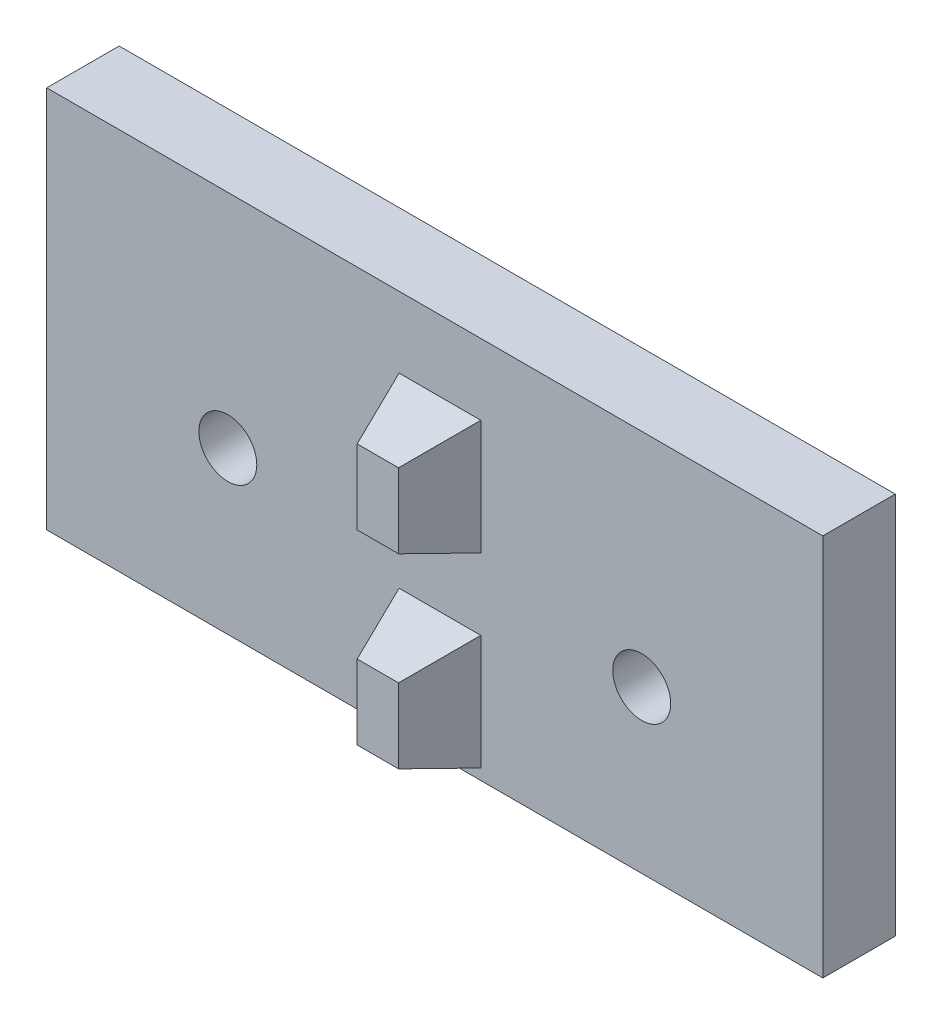
ISO-10303-21;
HEADER;
FILE_DESCRIPTION(('STEP AP214'),'2;1');
FILE_NAME('part.step','',(''),(''),'','','');
FILE_SCHEMA(('AUTOMOTIVE_DESIGN { 1 0 10303 214 1 1 1 1 }'));
ENDSEC;
DATA;
#1=APPLICATION_CONTEXT('core data for automotive mechanical design processes');
#2=APPLICATION_PROTOCOL_DEFINITION('international standard','automotive_design',2000,#1);
#3=PRODUCT_CONTEXT('',#1,'mechanical');
#4=PRODUCT('Part','Part','',(#3));
#5=PRODUCT_RELATED_PRODUCT_CATEGORY('part','',(#4));
#6=PRODUCT_DEFINITION_FORMATION('','',#4);
#7=PRODUCT_DEFINITION_CONTEXT('part definition',#1,'design');
#8=PRODUCT_DEFINITION('design','',#6,#7);
#9=PRODUCT_DEFINITION_SHAPE('','',#8);
#10=(LENGTH_UNIT() NAMED_UNIT(*) SI_UNIT(.MILLI.,.METRE.));
#11=(NAMED_UNIT(*) PLANE_ANGLE_UNIT() SI_UNIT($,.RADIAN.));
#12=(NAMED_UNIT(*) SI_UNIT($,.STERADIAN.) SOLID_ANGLE_UNIT());
#13=UNCERTAINTY_MEASURE_WITH_UNIT(LENGTH_MEASURE(1.E-05),#10,'distance_accuracy_value','');
#14=(GEOMETRIC_REPRESENTATION_CONTEXT(3) GLOBAL_UNCERTAINTY_ASSIGNED_CONTEXT((#13)) GLOBAL_UNIT_ASSIGNED_CONTEXT((#10,
#11,#12)) REPRESENTATION_CONTEXT('',''));
#15=CARTESIAN_POINT('',(0.,0.,0.));
#16=DIRECTION('',(0.,0.,1.));
#17=DIRECTION('',(1.,0.,0.));
#18=AXIS2_PLACEMENT_3D('',#15,#16,#17);
#19=CARTESIAN_POINT('',(0.,0.,3.5));
#20=DIRECTION('',(0.,0.,1.));
#21=DIRECTION('',(1.,0.,0.));
#22=AXIS2_PLACEMENT_3D('',#19,#20,#21);
#23=PLANE('',#22);
#24=DIRECTION('',(-1.,0.,0.));
#25=VECTOR('',#24,1.);
#26=CARTESIAN_POINT('',(0.,-17.9747590886987,3.5));
#27=LINE('',#26,#25);
#28=CARTESIAN_POINT('',(20.9747590886987,-17.9747590886987,3.5));
#29=VERTEX_POINT('',#28);
#30=CARTESIAN_POINT('',(17.0252409113013,-17.9747590886987,3.5));
#31=VERTEX_POINT('',#30);
#32=EDGE_CURVE('E42',#29,#31,#27,.T.);
#33=ORIENTED_EDGE('',*,*,#32,.T.);
#34=DIRECTION('',(0.,1.,0.));
#35=VECTOR('',#34,1.);
#36=CARTESIAN_POINT('',(17.0252409113013,0.,3.5));
#37=LINE('',#36,#35);
#38=CARTESIAN_POINT('',(17.0252409113013,-12.4252409113013,3.5));
#39=VERTEX_POINT('',#38);
#40=EDGE_CURVE('E11',#31,#39,#37,.T.);
#41=ORIENTED_EDGE('',*,*,#40,.T.);
#42=DIRECTION('',(1.,0.,0.));
#43=VECTOR('',#42,1.);
#44=CARTESIAN_POINT('',(0.,-12.4252409113013,3.5));
#45=LINE('',#44,#43);
#46=CARTESIAN_POINT('',(20.9747590886987,-12.4252409113013,3.5));
#47=VERTEX_POINT('',#46);
#48=EDGE_CURVE('E178',#39,#47,#45,.T.);
#49=ORIENTED_EDGE('',*,*,#48,.T.);
#50=DIRECTION('',(0.,-1.,0.));
#51=VECTOR('',#50,1.);
#52=CARTESIAN_POINT('',(20.9747590886987,0.,3.5));
#53=LINE('',#52,#51);
#54=EDGE_CURVE('E53',#47,#29,#53,.T.);
#55=ORIENTED_EDGE('',*,*,#54,.T.);
#56=EDGE_LOOP('',(#33,#41,#49,#55));
#57=FACE_BOUND('',#56,.T.);
#58=DIRECTION('',(-1.,0.,0.));
#59=VECTOR('',#58,1.);
#60=CARTESIAN_POINT('',(0.,-8.97475908869868,3.5));
#61=LINE('',#60,#59);
#62=CARTESIAN_POINT('',(20.9747590886987,-8.97475908869868,3.5));
#63=VERTEX_POINT('',#62);
#64=CARTESIAN_POINT('',(17.0252409113013,-8.97475908869868,3.5));
#65=VERTEX_POINT('',#64);
#66=EDGE_CURVE('E174',#63,#65,#61,.T.);
#67=ORIENTED_EDGE('',*,*,#66,.T.);
#68=DIRECTION('',(0.,1.,0.));
#69=VECTOR('',#68,1.);
#70=CARTESIAN_POINT('',(17.0252409113013,0.,3.5));
#71=LINE('',#70,#69);
#72=CARTESIAN_POINT('',(17.0252409113013,-3.42524091130131,3.5));
#73=VERTEX_POINT('',#72);
#74=EDGE_CURVE('E176',#65,#73,#71,.T.);
#75=ORIENTED_EDGE('',*,*,#74,.T.);
#76=DIRECTION('',(1.,0.,0.));
#77=VECTOR('',#76,1.);
#78=CARTESIAN_POINT('',(0.,-3.42524091130131,3.5));
#79=LINE('',#78,#77);
#80=CARTESIAN_POINT('',(20.9747590886987,-3.42524091130131,3.5));
#81=VERTEX_POINT('',#80);
#82=EDGE_CURVE('E169',#73,#81,#79,.T.);
#83=ORIENTED_EDGE('',*,*,#82,.T.);
#84=DIRECTION('',(0.,-1.,0.));
#85=VECTOR('',#84,1.);
#86=CARTESIAN_POINT('',(20.9747590886987,0.,3.5));
#87=LINE('',#86,#85);
#88=EDGE_CURVE('E172',#81,#63,#87,.T.);
#89=ORIENTED_EDGE('',*,*,#88,.T.);
#90=EDGE_LOOP('',(#67,#75,#83,#89));
#91=FACE_BOUND('',#90,.T.);
#92=CARTESIAN_POINT('',(8.75,-10.7,3.5));
#93=DIRECTION('',(0.,0.,1.));
#94=DIRECTION('',(1.,0.,0.));
#95=AXIS2_PLACEMENT_3D('',#92,#93,#94);
#96=CIRCLE('',#95,1.4);
#97=CARTESIAN_POINT('',(10.15,-10.7,3.5));
#98=VERTEX_POINT('',#97);
#99=EDGE_CURVE('E357',#98,#98,#96,.T.);
#100=ORIENTED_EDGE('',*,*,#99,.F.);
#101=EDGE_LOOP('',(#100));
#102=FACE_BOUND('',#101,.T.);
#103=DIRECTION('',(0.,-1.,0.));
#104=VECTOR('',#103,1.);
#105=CARTESIAN_POINT('',(0.,0.,3.5));
#106=LINE('',#105,#104);
#107=CARTESIAN_POINT('',(0.,0.,3.5));
#108=VERTEX_POINT('',#107);
#109=CARTESIAN_POINT('',(0.,-18.5,3.5));
#110=VERTEX_POINT('',#109);
#111=EDGE_CURVE('E132',#108,#110,#106,.T.);
#112=ORIENTED_EDGE('',*,*,#111,.T.);
#113=DIRECTION('',(1.,0.,0.));
#114=VECTOR('',#113,1.);
#115=CARTESIAN_POINT('',(0.,-18.5,3.5));
#116=LINE('',#115,#114);
#117=CARTESIAN_POINT('',(37.5,-18.5,3.5));
#118=VERTEX_POINT('',#117);
#119=EDGE_CURVE('E121',#110,#118,#116,.T.);
#120=ORIENTED_EDGE('',*,*,#119,.T.);
#121=DIRECTION('',(0.,1.,0.));
#122=VECTOR('',#121,1.);
#123=CARTESIAN_POINT('',(37.5,0.,3.5));
#124=LINE('',#123,#122);
#125=CARTESIAN_POINT('',(37.5,0.,3.5));
#126=VERTEX_POINT('',#125);
#127=EDGE_CURVE('E131',#118,#126,#124,.T.);
#128=ORIENTED_EDGE('',*,*,#127,.T.);
#129=DIRECTION('',(-1.,0.,0.));
#130=VECTOR('',#129,1.);
#131=CARTESIAN_POINT('',(0.,0.,3.5));
#132=LINE('',#131,#130);
#133=EDGE_CURVE('E137',#126,#108,#132,.T.);
#134=ORIENTED_EDGE('',*,*,#133,.T.);
#135=EDGE_LOOP('',(#112,#120,#128,#134));
#136=FACE_BOUND('',#135,.T.);
#137=CARTESIAN_POINT('',(28.75,-10.7,3.5));
#138=DIRECTION('',(0.,0.,1.));
#139=DIRECTION('',(1.,0.,0.));
#140=AXIS2_PLACEMENT_3D('',#137,#138,#139);
#141=CIRCLE('',#140,1.4);
#142=CARTESIAN_POINT('',(30.15,-10.7,3.5));
#143=VERTEX_POINT('',#142);
#144=EDGE_CURVE('E362',#143,#143,#141,.T.);
#145=ORIENTED_EDGE('',*,*,#144,.F.);
#146=EDGE_LOOP('',(#145));
#147=FACE_BOUND('',#146,.T.);
#148=ADVANCED_FACE('F33',(#57,#91,#102,#136,#147),#23,.T.);
#149=CARTESIAN_POINT('',(0.,0.,0.));
#150=DIRECTION('',(0.,0.,1.));
#151=DIRECTION('',(1.,0.,0.));
#152=AXIS2_PLACEMENT_3D('',#149,#150,#151);
#153=PLANE('',#152);
#154=DIRECTION('',(0.,-1.,0.));
#155=VECTOR('',#154,1.);
#156=CARTESIAN_POINT('',(0.,0.,0.));
#157=LINE('',#156,#155);
#158=CARTESIAN_POINT('',(0.,0.,0.));
#159=VERTEX_POINT('',#158);
#160=CARTESIAN_POINT('',(0.,-18.5,0.));
#161=VERTEX_POINT('',#160);
#162=EDGE_CURVE('E145',#159,#161,#157,.T.);
#163=ORIENTED_EDGE('',*,*,#162,.F.);
#164=DIRECTION('',(-1.,0.,0.));
#165=VECTOR('',#164,1.);
#166=CARTESIAN_POINT('',(0.,0.,0.));
#167=LINE('',#166,#165);
#168=CARTESIAN_POINT('',(37.5,0.,0.));
#169=VERTEX_POINT('',#168);
#170=EDGE_CURVE('E141',#169,#159,#167,.T.);
#171=ORIENTED_EDGE('',*,*,#170,.F.);
#172=DIRECTION('',(0.,1.,0.));
#173=VECTOR('',#172,1.);
#174=CARTESIAN_POINT('',(37.5,0.,0.));
#175=LINE('',#174,#173);
#176=CARTESIAN_POINT('',(37.5,-18.5,0.));
#177=VERTEX_POINT('',#176);
#178=EDGE_CURVE('E375',#177,#169,#175,.T.);
#179=ORIENTED_EDGE('',*,*,#178,.F.);
#180=DIRECTION('',(1.,0.,0.));
#181=VECTOR('',#180,1.);
#182=CARTESIAN_POINT('',(0.,-18.5,0.));
#183=LINE('',#182,#181);
#184=EDGE_CURVE('E373',#161,#177,#183,.T.);
#185=ORIENTED_EDGE('',*,*,#184,.F.);
#186=EDGE_LOOP('',(#163,#171,#179,#185));
#187=FACE_BOUND('',#186,.T.);
#188=CARTESIAN_POINT('',(8.75,-10.7,0.));
#189=DIRECTION('',(0.,0.,1.));
#190=DIRECTION('',(1.,0.,0.));
#191=AXIS2_PLACEMENT_3D('',#188,#189,#190);
#192=CIRCLE('',#191,1.4);
#193=CARTESIAN_POINT('',(10.15,-10.7,0.));
#194=VERTEX_POINT('',#193);
#195=EDGE_CURVE('E360',#194,#194,#192,.T.);
#196=ORIENTED_EDGE('',*,*,#195,.T.);
#197=EDGE_LOOP('',(#196));
#198=FACE_BOUND('',#197,.T.);
#199=CARTESIAN_POINT('',(28.75,-10.7,0.));
#200=DIRECTION('',(0.,0.,1.));
#201=DIRECTION('',(1.,0.,0.));
#202=AXIS2_PLACEMENT_3D('',#199,#200,#201);
#203=CIRCLE('',#202,1.4);
#204=CARTESIAN_POINT('',(30.15,-10.7,0.));
#205=VERTEX_POINT('',#204);
#206=EDGE_CURVE('E192',#205,#205,#203,.T.);
#207=ORIENTED_EDGE('',*,*,#206,.T.);
#208=EDGE_LOOP('',(#207));
#209=FACE_BOUND('',#208,.T.);
#210=ADVANCED_FACE('F233',(#187,#198,#209),#153,.F.);
#211=CARTESIAN_POINT('',(0.,0.,3.5));
#212=DIRECTION('',(1.,0.,0.));
#213=DIRECTION('',(0.,1.,0.));
#214=AXIS2_PLACEMENT_3D('',#211,#212,#213);
#215=PLANE('',#214);
#216=ORIENTED_EDGE('',*,*,#162,.T.);
#217=DIRECTION('',(0.,0.,-1.));
#218=VECTOR('',#217,1.);
#219=CARTESIAN_POINT('',(0.,-18.5,3.5));
#220=LINE('',#219,#218);
#221=EDGE_CURVE('E125',#110,#161,#220,.T.);
#222=ORIENTED_EDGE('',*,*,#221,.F.);
#223=ORIENTED_EDGE('',*,*,#111,.F.);
#224=DIRECTION('',(0.,0.,-1.));
#225=VECTOR('',#224,1.);
#226=CARTESIAN_POINT('',(0.,0.,3.5));
#227=LINE('',#226,#225);
#228=EDGE_CURVE('E371',#108,#159,#227,.T.);
#229=ORIENTED_EDGE('',*,*,#228,.T.);
#230=EDGE_LOOP('',(#216,#222,#223,#229));
#231=FACE_BOUND('',#230,.T.);
#232=ADVANCED_FACE('F143',(#231),#215,.F.);
#233=CARTESIAN_POINT('',(0.,-18.5,3.5));
#234=DIRECTION('',(0.,1.,0.));
#235=DIRECTION('',(0.,0.,1.));
#236=AXIS2_PLACEMENT_3D('',#233,#234,#235);
#237=PLANE('',#236);
#238=ORIENTED_EDGE('',*,*,#184,.T.);
#239=DIRECTION('',(0.,0.,-1.));
#240=VECTOR('',#239,1.);
#241=CARTESIAN_POINT('',(37.5,-18.5,3.5));
#242=LINE('',#241,#240);
#243=EDGE_CURVE('E128',#118,#177,#242,.T.);
#244=ORIENTED_EDGE('',*,*,#243,.F.);
#245=ORIENTED_EDGE('',*,*,#119,.F.);
#246=ORIENTED_EDGE('',*,*,#221,.T.);
#247=EDGE_LOOP('',(#238,#244,#245,#246));
#248=FACE_BOUND('',#247,.T.);
#249=ADVANCED_FACE('F123',(#248),#237,.F.);
#250=CARTESIAN_POINT('',(37.5,0.,3.5));
#251=DIRECTION('',(-1.,0.,0.));
#252=DIRECTION('',(0.,0.,1.));
#253=AXIS2_PLACEMENT_3D('',#250,#251,#252);
#254=PLANE('',#253);
#255=ORIENTED_EDGE('',*,*,#178,.T.);
#256=DIRECTION('',(0.,0.,-1.));
#257=VECTOR('',#256,1.);
#258=CARTESIAN_POINT('',(37.5,0.,3.5));
#259=LINE('',#258,#257);
#260=EDGE_CURVE('E150',#126,#169,#259,.T.);
#261=ORIENTED_EDGE('',*,*,#260,.F.);
#262=ORIENTED_EDGE('',*,*,#127,.F.);
#263=ORIENTED_EDGE('',*,*,#243,.T.);
#264=EDGE_LOOP('',(#255,#261,#262,#263));
#265=FACE_BOUND('',#264,.T.);
#266=ADVANCED_FACE('F245',(#265),#254,.F.);
#267=CARTESIAN_POINT('',(0.,0.,3.5));
#268=DIRECTION('',(0.,-1.,0.));
#269=DIRECTION('',(0.,0.,-1.));
#270=AXIS2_PLACEMENT_3D('',#267,#268,#269);
#271=PLANE('',#270);
#272=ORIENTED_EDGE('',*,*,#170,.T.);
#273=ORIENTED_EDGE('',*,*,#228,.F.);
#274=ORIENTED_EDGE('',*,*,#133,.F.);
#275=ORIENTED_EDGE('',*,*,#260,.T.);
#276=EDGE_LOOP('',(#272,#273,#274,#275));
#277=FACE_BOUND('',#276,.T.);
#278=ADVANCED_FACE('F242',(#277),#271,.F.);
#279=CARTESIAN_POINT('',(8.75,-10.7,3.5));
#280=DIRECTION('',(0.,0.,-1.));
#281=DIRECTION('',(-1.,0.,0.));
#282=AXIS2_PLACEMENT_3D('',#279,#280,#281);
#283=CYLINDRICAL_SURFACE('',#282,1.4);
#284=ORIENTED_EDGE('',*,*,#99,.T.);
#285=EDGE_LOOP('',(#284));
#286=FACE_BOUND('',#285,.T.);
#287=ORIENTED_EDGE('',*,*,#195,.F.);
#288=EDGE_LOOP('',(#287));
#289=FACE_BOUND('',#288,.T.);
#290=ADVANCED_FACE('F229',(#286,#289),#283,.F.);
#291=CARTESIAN_POINT('',(28.75,-10.7,3.5));
#292=DIRECTION('',(0.,0.,-1.));
#293=DIRECTION('',(-1.,0.,0.));
#294=AXIS2_PLACEMENT_3D('',#291,#292,#293);
#295=CYLINDRICAL_SURFACE('',#294,1.4);
#296=ORIENTED_EDGE('',*,*,#144,.T.);
#297=EDGE_LOOP('',(#296));
#298=FACE_BOUND('',#297,.T.);
#299=ORIENTED_EDGE('',*,*,#206,.F.);
#300=EDGE_LOOP('',(#299));
#301=FACE_BOUND('',#300,.T.);
#302=ADVANCED_FACE('F220',(#298,#301),#295,.F.);
#303=CARTESIAN_POINT('',(0.,0.,6.5));
#304=DIRECTION('',(0.,0.,1.));
#305=DIRECTION('',(1.,0.,0.));
#306=AXIS2_PLACEMENT_3D('',#303,#304,#305);
#307=PLANE('',#306);
#308=DIRECTION('',(0.,1.,0.));
#309=VECTOR('',#308,1.);
#310=CARTESIAN_POINT('',(20.,-12.4,6.5));
#311=LINE('',#310,#309);
#312=CARTESIAN_POINT('',(20.,-17.,6.5));
#313=VERTEX_POINT('',#312);
#314=CARTESIAN_POINT('',(20.,-13.4,6.5));
#315=VERTEX_POINT('',#314);
#316=EDGE_CURVE('E164',#313,#315,#311,.T.);
#317=ORIENTED_EDGE('',*,*,#316,.T.);
#318=DIRECTION('',(-1.,0.,0.));
#319=VECTOR('',#318,1.);
#320=CARTESIAN_POINT('',(17.,-13.4,6.5));
#321=LINE('',#320,#319);
#322=CARTESIAN_POINT('',(18.,-13.4,6.5));
#323=VERTEX_POINT('',#322);
#324=EDGE_CURVE('E166',#315,#323,#321,.T.);
#325=ORIENTED_EDGE('',*,*,#324,.T.);
#326=DIRECTION('',(0.,-1.,0.));
#327=VECTOR('',#326,1.);
#328=CARTESIAN_POINT('',(18.,-18.,6.5));
#329=LINE('',#328,#327);
#330=CARTESIAN_POINT('',(18.,-17.,6.5));
#331=VERTEX_POINT('',#330);
#332=EDGE_CURVE('E160',#323,#331,#329,.T.);
#333=ORIENTED_EDGE('',*,*,#332,.T.);
#334=DIRECTION('',(1.,0.,0.));
#335=VECTOR('',#334,1.);
#336=CARTESIAN_POINT('',(21.,-17.,6.5));
#337=LINE('',#336,#335);
#338=EDGE_CURVE('E162',#331,#313,#337,.T.);
#339=ORIENTED_EDGE('',*,*,#338,.T.);
#340=EDGE_LOOP('',(#317,#325,#333,#339));
#341=FACE_BOUND('',#340,.T.);
#342=ADVANCED_FACE('F217',(#341),#307,.T.);
#343=CARTESIAN_POINT('',(0.,0.,6.5));
#344=DIRECTION('',(0.,0.,1.));
#345=DIRECTION('',(1.,0.,0.));
#346=AXIS2_PLACEMENT_3D('',#343,#344,#345);
#347=PLANE('',#346);
#348=DIRECTION('',(0.,1.,0.));
#349=VECTOR('',#348,1.);
#350=CARTESIAN_POINT('',(20.,-3.4,6.5));
#351=LINE('',#350,#349);
#352=CARTESIAN_POINT('',(20.,-7.99999999999998,6.5));
#353=VERTEX_POINT('',#352);
#354=CARTESIAN_POINT('',(20.,-4.40000000000002,6.5));
#355=VERTEX_POINT('',#354);
#356=EDGE_CURVE('E155',#353,#355,#351,.T.);
#357=ORIENTED_EDGE('',*,*,#356,.T.);
#358=DIRECTION('',(-1.,0.,0.));
#359=VECTOR('',#358,1.);
#360=CARTESIAN_POINT('',(17.,-4.40000000000002,6.5));
#361=LINE('',#360,#359);
#362=CARTESIAN_POINT('',(18.,-4.40000000000002,6.5));
#363=VERTEX_POINT('',#362);
#364=EDGE_CURVE('E157',#355,#363,#361,.T.);
#365=ORIENTED_EDGE('',*,*,#364,.T.);
#366=DIRECTION('',(0.,-1.,0.));
#367=VECTOR('',#366,1.);
#368=CARTESIAN_POINT('',(18.,-9.,6.5));
#369=LINE('',#368,#367);
#370=CARTESIAN_POINT('',(18.,-7.99999999999998,6.5));
#371=VERTEX_POINT('',#370);
#372=EDGE_CURVE('E146',#363,#371,#369,.T.);
#373=ORIENTED_EDGE('',*,*,#372,.T.);
#374=DIRECTION('',(1.,0.,0.));
#375=VECTOR('',#374,1.);
#376=CARTESIAN_POINT('',(21.,-7.99999999999998,6.5));
#377=LINE('',#376,#375);
#378=EDGE_CURVE('E148',#371,#353,#377,.T.);
#379=ORIENTED_EDGE('',*,*,#378,.T.);
#380=EDGE_LOOP('',(#357,#365,#373,#379));
#381=FACE_BOUND('',#380,.T.);
#382=ADVANCED_FACE('F219',(#381),#347,.T.);
#383=CARTESIAN_POINT('',(0.,-7.99999999999998,6.5));
#384=DIRECTION('',(0.,-0.951056516295155,0.309016994374944));
#385=DIRECTION('',(-1.,0.,0.));
#386=AXIS2_PLACEMENT_3D('',#383,#384,#385);
#387=PLANE('',#386);
#388=DIRECTION('',(0.295241808844324,0.295241808844324,0.908660854566028));
#389=VECTOR('',#388,1.);
#390=CARTESIAN_POINT('',(18.6973418055174,-7.30265819448263,8.64619739462482));
#391=LINE('',#390,#389);
#392=EDGE_CURVE('E186',#65,#371,#391,.T.);
#393=ORIENTED_EDGE('',*,*,#392,.F.);
#394=ORIENTED_EDGE('',*,*,#66,.F.);
#395=DIRECTION('',(-0.295241808844324,0.295241808844324,0.908660854566028));
#396=VECTOR('',#395,1.);
#397=CARTESIAN_POINT('',(18.2566454862066,-6.25664548620662,11.8654934865621));
#398=LINE('',#397,#396);
#399=EDGE_CURVE('E189',#353,#63,#398,.F.);
#400=ORIENTED_EDGE('',*,*,#399,.F.);
#401=ORIENTED_EDGE('',*,*,#378,.F.);
#402=EDGE_LOOP('',(#393,#394,#400,#401));
#403=FACE_BOUND('',#402,.T.);
#404=ADVANCED_FACE('F226',(#403),#387,.T.);
#405=CARTESIAN_POINT('',(20.,0.,6.5));
#406=DIRECTION('',(0.951056516295155,0.,0.309016994374944));
#407=DIRECTION('',(0.,-1.,0.));
#408=AXIS2_PLACEMENT_3D('',#405,#406,#407);
#409=PLANE('',#408);
#410=ORIENTED_EDGE('',*,*,#399,.T.);
#411=ORIENTED_EDGE('',*,*,#88,.F.);
#412=DIRECTION('',(-0.295241808844324,-0.295241808844324,0.908660854566028));
#413=VECTOR('',#412,1.);
#414=CARTESIAN_POINT('',(20.3835379930345,-4.01646200696548,5.31959143295634));
#415=LINE('',#414,#413);
#416=EDGE_CURVE('E184',#355,#81,#415,.F.);
#417=ORIENTED_EDGE('',*,*,#416,.F.);
#418=ORIENTED_EDGE('',*,*,#356,.F.);
#419=EDGE_LOOP('',(#410,#411,#417,#418));
#420=FACE_BOUND('',#419,.T.);
#421=ADVANCED_FACE('F261',(#420),#409,.T.);
#422=CARTESIAN_POINT('',(18.,0.,6.5));
#423=DIRECTION('',(-0.951056516295155,0.,0.309016994374944));
#424=DIRECTION('',(0.,1.,0.));
#425=AXIS2_PLACEMENT_3D('',#422,#423,#424);
#426=PLANE('',#425);
#427=ORIENTED_EDGE('',*,*,#392,.T.);
#428=ORIENTED_EDGE('',*,*,#372,.F.);
#429=DIRECTION('',(-0.295241808844324,0.295241808844324,-0.908660854566028));
#430=VECTOR('',#429,1.);
#431=CARTESIAN_POINT('',(17.6164620069655,-4.01646200696548,5.31959143295634));
#432=LINE('',#431,#430);
#433=EDGE_CURVE('E182',#73,#363,#432,.F.);
#434=ORIENTED_EDGE('',*,*,#433,.F.);
#435=ORIENTED_EDGE('',*,*,#74,.F.);
#436=EDGE_LOOP('',(#427,#428,#434,#435));
#437=FACE_BOUND('',#436,.T.);
#438=ADVANCED_FACE('F257',(#437),#426,.T.);
#439=CARTESIAN_POINT('',(0.,-4.40000000000002,6.5));
#440=DIRECTION('',(0.,0.951056516295155,0.309016994374944));
#441=DIRECTION('',(1.,0.,0.));
#442=AXIS2_PLACEMENT_3D('',#439,#440,#441);
#443=PLANE('',#442);
#444=ORIENTED_EDGE('',*,*,#416,.T.);
#445=ORIENTED_EDGE('',*,*,#82,.F.);
#446=ORIENTED_EDGE('',*,*,#433,.T.);
#447=ORIENTED_EDGE('',*,*,#364,.F.);
#448=EDGE_LOOP('',(#444,#445,#446,#447));
#449=FACE_BOUND('',#448,.T.);
#450=ADVANCED_FACE('F254',(#449),#443,.T.);
#451=CARTESIAN_POINT('',(0.,-17.,6.5));
#452=DIRECTION('',(0.,-0.951056516295155,0.309016994374944));
#453=DIRECTION('',(-1.,0.,0.));
#454=AXIS2_PLACEMENT_3D('',#451,#452,#453);
#455=PLANE('',#454);
#456=DIRECTION('',(0.295241808844324,0.295241808844324,0.908660854566028));
#457=VECTOR('',#456,1.);
#458=CARTESIAN_POINT('',(19.4818513367244,-15.5181486632756,11.0606694635777));
#459=LINE('',#458,#457);
#460=EDGE_CURVE('E196',#31,#331,#459,.T.);
#461=ORIENTED_EDGE('',*,*,#460,.F.);
#462=ORIENTED_EDGE('',*,*,#32,.F.);
#463=DIRECTION('',(-0.295241808844324,0.295241808844324,0.908660854566028));
#464=VECTOR('',#463,1.);
#465=CARTESIAN_POINT('',(18.2566454862066,-15.2566454862066,11.8654934865621));
#466=LINE('',#465,#464);
#467=EDGE_CURVE('E37',#313,#29,#466,.F.);
#468=ORIENTED_EDGE('',*,*,#467,.F.);
#469=ORIENTED_EDGE('',*,*,#338,.F.);
#470=EDGE_LOOP('',(#461,#462,#468,#469));
#471=FACE_BOUND('',#470,.T.);
#472=ADVANCED_FACE('F35',(#471),#455,.T.);
#473=CARTESIAN_POINT('',(20.,0.,6.5));
#474=DIRECTION('',(0.951056516295155,0.,0.309016994374944));
#475=DIRECTION('',(0.,-1.,0.));
#476=AXIS2_PLACEMENT_3D('',#473,#474,#475);
#477=PLANE('',#476);
#478=ORIENTED_EDGE('',*,*,#467,.T.);
#479=ORIENTED_EDGE('',*,*,#54,.F.);
#480=DIRECTION('',(-0.295241808844324,-0.295241808844324,0.908660854566028));
#481=VECTOR('',#480,1.);
#482=CARTESIAN_POINT('',(21.1680475242415,-12.2319524757585,2.90511936400342));
#483=LINE('',#482,#481);
#484=EDGE_CURVE('E195',#315,#47,#483,.F.);
#485=ORIENTED_EDGE('',*,*,#484,.F.);
#486=ORIENTED_EDGE('',*,*,#316,.F.);
#487=EDGE_LOOP('',(#478,#479,#485,#486));
#488=FACE_BOUND('',#487,.T.);
#489=ADVANCED_FACE('F205',(#488),#477,.T.);
#490=CARTESIAN_POINT('',(18.,0.,6.5));
#491=DIRECTION('',(-0.951056516295155,0.,0.309016994374944));
#492=DIRECTION('',(0.,1.,0.));
#493=AXIS2_PLACEMENT_3D('',#490,#491,#492);
#494=PLANE('',#493);
#495=ORIENTED_EDGE('',*,*,#460,.T.);
#496=ORIENTED_EDGE('',*,*,#332,.F.);
#497=DIRECTION('',(-0.295241808844324,0.295241808844324,-0.908660854566028));
#498=VECTOR('',#497,1.);
#499=CARTESIAN_POINT('',(16.8319524757585,-12.2319524757585,2.90511936400342));
#500=LINE('',#499,#498);
#501=EDGE_CURVE('E193',#39,#323,#500,.F.);
#502=ORIENTED_EDGE('',*,*,#501,.F.);
#503=ORIENTED_EDGE('',*,*,#40,.F.);
#504=EDGE_LOOP('',(#495,#496,#502,#503));
#505=FACE_BOUND('',#504,.T.);
#506=ADVANCED_FACE('F210',(#505),#494,.T.);
#507=CARTESIAN_POINT('',(0.,-13.4,6.5));
#508=DIRECTION('',(0.,0.951056516295155,0.309016994374944));
#509=DIRECTION('',(1.,0.,0.));
#510=AXIS2_PLACEMENT_3D('',#507,#508,#509);
#511=PLANE('',#510);
#512=ORIENTED_EDGE('',*,*,#484,.T.);
#513=ORIENTED_EDGE('',*,*,#48,.F.);
#514=ORIENTED_EDGE('',*,*,#501,.T.);
#515=ORIENTED_EDGE('',*,*,#324,.F.);
#516=EDGE_LOOP('',(#512,#513,#514,#515));
#517=FACE_BOUND('',#516,.T.);
#518=ADVANCED_FACE('F214',(#517),#511,.T.);
#519=CLOSED_SHELL('',(#148,#210,#232,#249,#266,#278,#290,#302,#342,#382,#404,#421,#438,#450,
#472,#489,#506,#518));
#520=MANIFOLD_SOLID_BREP('B2',#519);
#521=ADVANCED_BREP_SHAPE_REPRESENTATION('',(#18,#520),#14);
#522=SHAPE_DEFINITION_REPRESENTATION(#9,#521);
ENDSEC;
END-ISO-10303-21;
